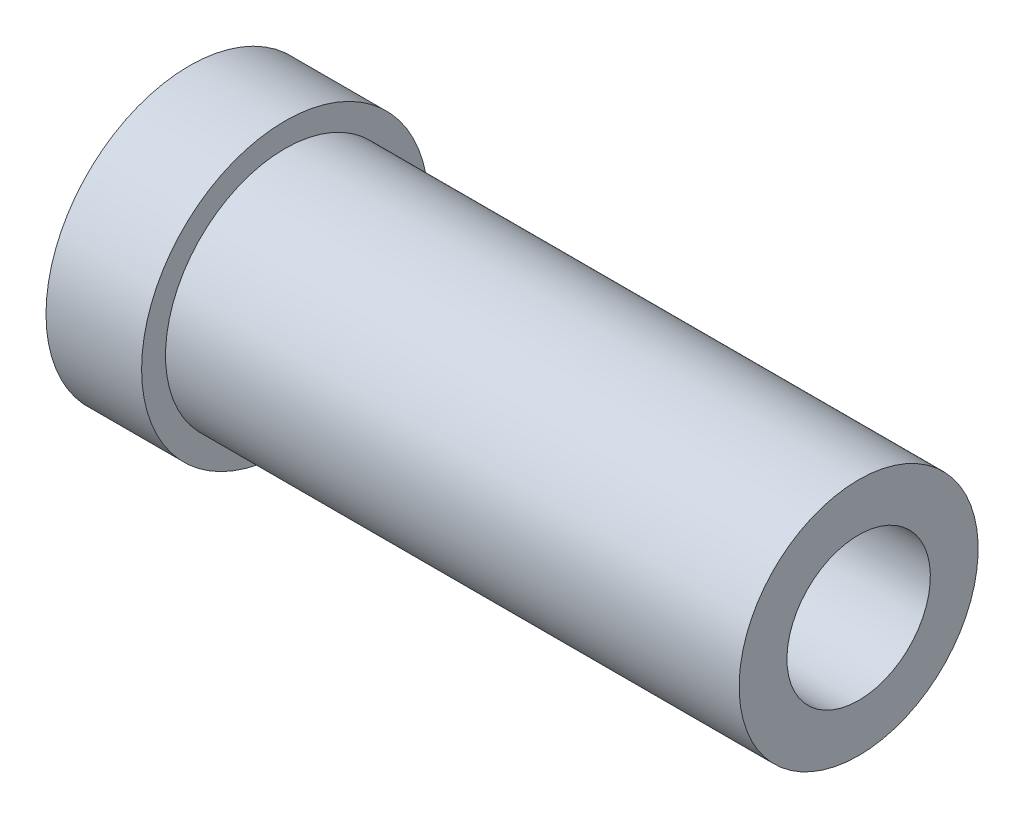
ISO-10303-21;
HEADER;
FILE_DESCRIPTION(('STEP AP214'),'2;1');
FILE_NAME('part.step','',(''),(''),'','','');
FILE_SCHEMA(('AUTOMOTIVE_DESIGN { 1 0 10303 214 1 1 1 1 }'));
ENDSEC;
DATA;
#1=APPLICATION_CONTEXT('core data for automotive mechanical design processes');
#2=APPLICATION_PROTOCOL_DEFINITION('international standard','automotive_design',2000,#1);
#3=PRODUCT_CONTEXT('',#1,'mechanical');
#4=PRODUCT('Part','Part','',(#3));
#5=PRODUCT_RELATED_PRODUCT_CATEGORY('part','',(#4));
#6=PRODUCT_DEFINITION_FORMATION('','',#4);
#7=PRODUCT_DEFINITION_CONTEXT('part definition',#1,'design');
#8=PRODUCT_DEFINITION('design','',#6,#7);
#9=PRODUCT_DEFINITION_SHAPE('','',#8);
#10=(LENGTH_UNIT() NAMED_UNIT(*) SI_UNIT(.MILLI.,.METRE.));
#11=(NAMED_UNIT(*) PLANE_ANGLE_UNIT() SI_UNIT($,.RADIAN.));
#12=(NAMED_UNIT(*) SI_UNIT($,.STERADIAN.) SOLID_ANGLE_UNIT());
#13=UNCERTAINTY_MEASURE_WITH_UNIT(LENGTH_MEASURE(1.E-05),#10,'distance_accuracy_value','');
#14=(GEOMETRIC_REPRESENTATION_CONTEXT(3) GLOBAL_UNCERTAINTY_ASSIGNED_CONTEXT((#13)) GLOBAL_UNIT_ASSIGNED_CONTEXT((#10,
#11,#12)) REPRESENTATION_CONTEXT('',''));
#15=CARTESIAN_POINT('',(0.,0.,0.));
#16=DIRECTION('',(0.,0.,1.));
#17=DIRECTION('',(1.,0.,0.));
#18=AXIS2_PLACEMENT_3D('',#15,#16,#17);
#19=CARTESIAN_POINT('',(3.6255839132242,2.5,0.));
#20=DIRECTION('',(-1.,0.,0.));
#21=DIRECTION('',(0.,-1.,0.));
#22=AXIS2_PLACEMENT_3D('',#19,#20,#21);
#23=PLANE('',#22);
#24=CARTESIAN_POINT('',(3.6255839132242,0.,0.));
#25=DIRECTION('',(-1.,0.,0.));
#26=DIRECTION('',(0.,-1.,0.));
#27=AXIS2_PLACEMENT_3D('',#24,#25,#26);
#28=CIRCLE('',#27,3.);
#29=CARTESIAN_POINT('',(3.6255839132242,-3.,0.));
#30=VERTEX_POINT('',#29);
#31=EDGE_CURVE('E10',#30,#30,#28,.T.);
#32=ORIENTED_EDGE('',*,*,#31,.F.);
#33=EDGE_LOOP('',(#32));
#34=FACE_BOUND('',#33,.T.);
#35=CARTESIAN_POINT('',(3.6255839132242,0.,0.));
#36=DIRECTION('',(-1.,0.,0.));
#37=DIRECTION('',(0.,-1.,0.));
#38=AXIS2_PLACEMENT_3D('',#35,#36,#37);
#39=CIRCLE('',#38,2.5);
#40=CARTESIAN_POINT('',(3.6255839132242,-2.5,0.));
#41=VERTEX_POINT('',#40);
#42=EDGE_CURVE('E68',#41,#41,#39,.T.);
#43=ORIENTED_EDGE('',*,*,#42,.T.);
#44=EDGE_LOOP('',(#43));
#45=FACE_BOUND('',#44,.T.);
#46=ADVANCED_FACE('F41',(#34,#45),#23,.F.);
#47=CARTESIAN_POINT('',(0.,0.,0.));
#48=DIRECTION('',(-1.,0.,0.));
#49=DIRECTION('',(0.,-1.,0.));
#50=AXIS2_PLACEMENT_3D('',#47,#48,#49);
#51=CYLINDRICAL_SURFACE('',#50,3.);
#52=CARTESIAN_POINT('',(1.6255839132242,0.,0.));
#53=DIRECTION('',(-1.,0.,0.));
#54=DIRECTION('',(0.,-1.,0.));
#55=AXIS2_PLACEMENT_3D('',#52,#53,#54);
#56=CIRCLE('',#55,3.);
#57=CARTESIAN_POINT('',(1.62558391322421,-3.,0.));
#58=VERTEX_POINT('',#57);
#59=EDGE_CURVE('E48',#58,#58,#56,.T.);
#60=ORIENTED_EDGE('',*,*,#59,.F.);
#61=EDGE_LOOP('',(#60));
#62=FACE_BOUND('',#61,.T.);
#63=ORIENTED_EDGE('',*,*,#31,.T.);
#64=EDGE_LOOP('',(#63));
#65=FACE_BOUND('',#64,.T.);
#66=ADVANCED_FACE('F99',(#62,#65),#51,.T.);
#67=CARTESIAN_POINT('',(1.6255839132242,3.,0.));
#68=DIRECTION('',(1.,0.,0.));
#69=DIRECTION('',(0.,1.,0.));
#70=AXIS2_PLACEMENT_3D('',#67,#68,#69);
#71=PLANE('',#70);
#72=ORIENTED_EDGE('',*,*,#59,.T.);
#73=EDGE_LOOP('',(#72));
#74=FACE_BOUND('',#73,.T.);
#75=ADVANCED_FACE('F94',(#74),#71,.F.);
#76=CARTESIAN_POINT('',(3.6255839132242,1.5,0.));
#77=DIRECTION('',(-1.,0.,0.));
#78=DIRECTION('',(0.,-1.,0.));
#79=AXIS2_PLACEMENT_3D('',#76,#77,#78);
#80=PLANE('',#79);
#81=CARTESIAN_POINT('',(3.6255839132242,0.,0.));
#82=DIRECTION('',(-1.,0.,0.));
#83=DIRECTION('',(0.,-1.,0.));
#84=AXIS2_PLACEMENT_3D('',#81,#82,#83);
#85=CIRCLE('',#84,1.5);
#86=CARTESIAN_POINT('',(3.62558391322421,-1.5,0.));
#87=VERTEX_POINT('',#86);
#88=EDGE_CURVE('E53',#87,#87,#85,.T.);
#89=ORIENTED_EDGE('',*,*,#88,.F.);
#90=EDGE_LOOP('',(#89));
#91=FACE_BOUND('',#90,.T.);
#92=ADVANCED_FACE('F89',(#91),#80,.F.);
#93=CARTESIAN_POINT('',(0.,0.,0.));
#94=DIRECTION('',(-1.,0.,0.));
#95=DIRECTION('',(0.,-1.,0.));
#96=AXIS2_PLACEMENT_3D('',#93,#94,#95);
#97=CYLINDRICAL_SURFACE('',#96,1.5);
#98=CARTESIAN_POINT('',(15.6255839132242,0.,0.));
#99=DIRECTION('',(-1.,0.,0.));
#100=DIRECTION('',(0.,-1.,0.));
#101=AXIS2_PLACEMENT_3D('',#98,#99,#100);
#102=CIRCLE('',#101,1.5);
#103=CARTESIAN_POINT('',(15.6255839132242,-1.49999999999999,0.));
#104=VERTEX_POINT('',#103);
#105=EDGE_CURVE('E58',#104,#104,#102,.T.);
#106=ORIENTED_EDGE('',*,*,#105,.F.);
#107=EDGE_LOOP('',(#106));
#108=FACE_BOUND('',#107,.T.);
#109=ORIENTED_EDGE('',*,*,#88,.T.);
#110=EDGE_LOOP('',(#109));
#111=FACE_BOUND('',#110,.T.);
#112=ADVANCED_FACE('F83',(#108,#111),#97,.F.);
#113=CARTESIAN_POINT('',(15.6255839132242,2.5,0.));
#114=DIRECTION('',(-1.,0.,0.));
#115=DIRECTION('',(0.,-1.,0.));
#116=AXIS2_PLACEMENT_3D('',#113,#114,#115);
#117=PLANE('',#116);
#118=CARTESIAN_POINT('',(15.6255839132242,0.,0.));
#119=DIRECTION('',(-1.,0.,0.));
#120=DIRECTION('',(0.,-1.,0.));
#121=AXIS2_PLACEMENT_3D('',#118,#119,#120);
#122=CIRCLE('',#121,2.5);
#123=CARTESIAN_POINT('',(15.6255839132242,-2.49999999999999,0.));
#124=VERTEX_POINT('',#123);
#125=EDGE_CURVE('E64',#124,#124,#122,.T.);
#126=ORIENTED_EDGE('',*,*,#125,.F.);
#127=EDGE_LOOP('',(#126));
#128=FACE_BOUND('',#127,.T.);
#129=ORIENTED_EDGE('',*,*,#105,.T.);
#130=EDGE_LOOP('',(#129));
#131=FACE_BOUND('',#130,.T.);
#132=ADVANCED_FACE('F77',(#128,#131),#117,.F.);
#133=CARTESIAN_POINT('',(0.,0.,0.));
#134=DIRECTION('',(-1.,0.,0.));
#135=DIRECTION('',(0.,-1.,0.));
#136=AXIS2_PLACEMENT_3D('',#133,#134,#135);
#137=CYLINDRICAL_SURFACE('',#136,2.5);
#138=ORIENTED_EDGE('',*,*,#42,.F.);
#139=EDGE_LOOP('',(#138));
#140=FACE_BOUND('',#139,.T.);
#141=ORIENTED_EDGE('',*,*,#125,.T.);
#142=EDGE_LOOP('',(#141));
#143=FACE_BOUND('',#142,.T.);
#144=ADVANCED_FACE('F74',(#140,#143),#137,.T.);
#145=CLOSED_SHELL('',(#46,#66,#75,#92,#112,#132,#144));
#146=MANIFOLD_SOLID_BREP('B2',#145);
#147=ADVANCED_BREP_SHAPE_REPRESENTATION('',(#18,#146),#14);
#148=SHAPE_DEFINITION_REPRESENTATION(#9,#147);
ENDSEC;
END-ISO-10303-21;
